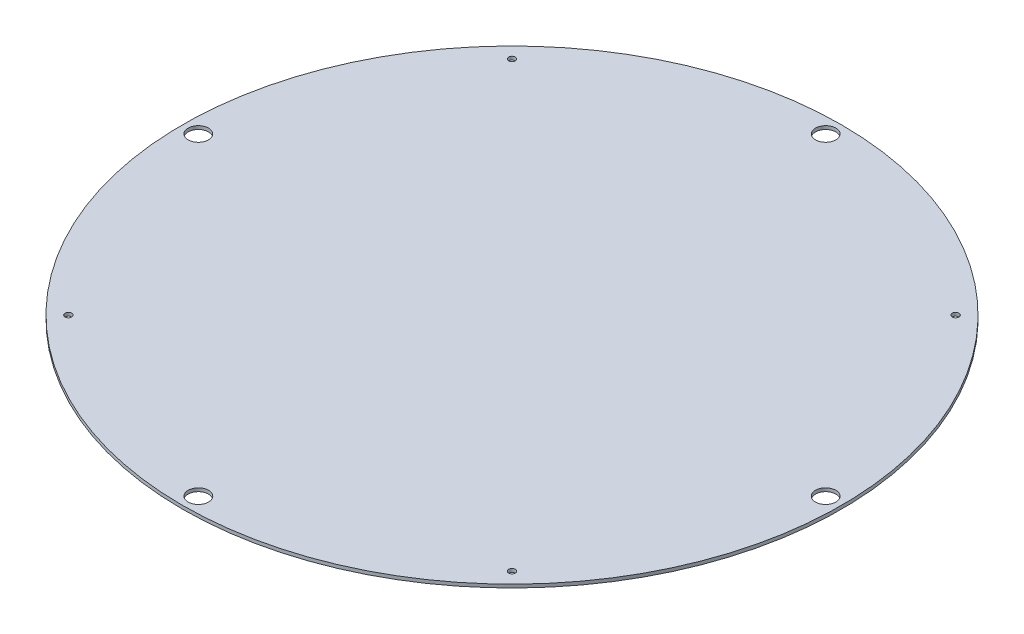
ISO-10303-21;
HEADER;
FILE_DESCRIPTION(('STEP AP214'),'2;1');
FILE_NAME('part.step','',(''),(''),'','','');
FILE_SCHEMA(('AUTOMOTIVE_DESIGN { 1 0 10303 214 1 1 1 1 }'));
ENDSEC;
DATA;
#1=APPLICATION_CONTEXT('core data for automotive mechanical design processes');
#2=APPLICATION_PROTOCOL_DEFINITION('international standard','automotive_design',2000,#1);
#3=PRODUCT_CONTEXT('',#1,'mechanical');
#4=PRODUCT('Part','Part','',(#3));
#5=PRODUCT_RELATED_PRODUCT_CATEGORY('part','',(#4));
#6=PRODUCT_DEFINITION_FORMATION('','',#4);
#7=PRODUCT_DEFINITION_CONTEXT('part definition',#1,'design');
#8=PRODUCT_DEFINITION('design','',#6,#7);
#9=PRODUCT_DEFINITION_SHAPE('','',#8);
#10=(LENGTH_UNIT() NAMED_UNIT(*) SI_UNIT(.MILLI.,.METRE.));
#11=(NAMED_UNIT(*) PLANE_ANGLE_UNIT() SI_UNIT($,.RADIAN.));
#12=(NAMED_UNIT(*) SI_UNIT($,.STERADIAN.) SOLID_ANGLE_UNIT());
#13=UNCERTAINTY_MEASURE_WITH_UNIT(LENGTH_MEASURE(1.E-05),#10,'distance_accuracy_value','');
#14=(GEOMETRIC_REPRESENTATION_CONTEXT(3) GLOBAL_UNCERTAINTY_ASSIGNED_CONTEXT((#13)) GLOBAL_UNIT_ASSIGNED_CONTEXT((#10,
#11,#12)) REPRESENTATION_CONTEXT('',''));
#15=CARTESIAN_POINT('',(0.,0.,0.));
#16=DIRECTION('',(0.,0.,1.));
#17=DIRECTION('',(1.,0.,0.));
#18=AXIS2_PLACEMENT_3D('',#15,#16,#17);
#19=CARTESIAN_POINT('',(394.086664394288,267.664131828965,1032.56245418889));
#20=DIRECTION('',(0.,1.,0.));
#21=DIRECTION('',(0.,0.,1.));
#22=AXIS2_PLACEMENT_3D('',#19,#20,#21);
#23=PLANE('',#22);
#24=CARTESIAN_POINT('',(526.669185866769,267.664131828965,1165.14497566137));
#25=DIRECTION('',(0.,1.,0.));
#26=DIRECTION('',(0.,0.,1.));
#27=AXIS2_PLACEMENT_3D('',#24,#25,#26);
#28=CIRCLE('',#27,2.00000000000565);
#29=CARTESIAN_POINT('',(526.669185866769,267.664131828965,1167.14497566137));
#30=VERTEX_POINT('',#29);
#31=EDGE_CURVE('E96',#30,#30,#28,.T.);
#32=ORIENTED_EDGE('',*,*,#31,.F.);
#33=EDGE_LOOP('',(#32));
#34=FACE_BOUND('',#33,.T.);
#35=CARTESIAN_POINT('',(261.50414292181,267.664131828965,899.979932716417));
#36=DIRECTION('',(0.,1.,0.));
#37=DIRECTION('',(0.,0.,1.));
#38=AXIS2_PLACEMENT_3D('',#35,#36,#37);
#39=CIRCLE('',#38,2.);
#40=CARTESIAN_POINT('',(261.50414292181,267.664131828965,901.979932716417));
#41=VERTEX_POINT('',#40);
#42=EDGE_CURVE('E80',#41,#41,#39,.T.);
#43=ORIENTED_EDGE('',*,*,#42,.F.);
#44=EDGE_LOOP('',(#43));
#45=FACE_BOUND('',#44,.T.);
#46=CARTESIAN_POINT('',(581.586664394293,267.664131828965,1032.56245418889));
#47=DIRECTION('',(0.,1.,0.));
#48=DIRECTION('',(0.,0.,1.));
#49=AXIS2_PLACEMENT_3D('',#46,#47,#48);
#50=CIRCLE('',#49,6.09999999999991);
#51=CARTESIAN_POINT('',(581.586664394293,267.664131828965,1038.66245418889));
#52=VERTEX_POINT('',#51);
#53=EDGE_CURVE('E65',#52,#52,#50,.T.);
#54=ORIENTED_EDGE('',*,*,#53,.F.);
#55=EDGE_LOOP('',(#54));
#56=FACE_BOUND('',#55,.T.);
#57=CARTESIAN_POINT('',(394.086664394288,267.664131828965,845.062454188894));
#58=DIRECTION('',(0.,1.,0.));
#59=DIRECTION('',(0.,0.,1.));
#60=AXIS2_PLACEMENT_3D('',#57,#58,#59);
#61=CIRCLE('',#60,6.1);
#62=CARTESIAN_POINT('',(394.086664394288,267.664131828965,851.162454188894));
#63=VERTEX_POINT('',#62);
#64=EDGE_CURVE('E51',#63,#63,#61,.T.);
#65=ORIENTED_EDGE('',*,*,#64,.F.);
#66=EDGE_LOOP('',(#65));
#67=FACE_BOUND('',#66,.T.);
#68=CARTESIAN_POINT('',(394.086664394288,267.664131828965,1032.56245418889));
#69=DIRECTION('',(0.,1.,0.));
#70=DIRECTION('',(0.,0.,1.));
#71=AXIS2_PLACEMENT_3D('',#68,#69,#70);
#72=CIRCLE('',#71,197.);
#73=CARTESIAN_POINT('',(394.086664394288,267.664131828965,1229.56245418889));
#74=VERTEX_POINT('',#73);
#75=EDGE_CURVE('E10',#74,#74,#72,.T.);
#76=ORIENTED_EDGE('',*,*,#75,.T.);
#77=EDGE_LOOP('',(#76));
#78=FACE_BOUND('',#77,.T.);
#79=CARTESIAN_POINT('',(394.086664394299,267.664131828965,1220.06245418889));
#80=DIRECTION('',(0.,1.,0.));
#81=DIRECTION('',(0.,0.,1.));
#82=AXIS2_PLACEMENT_3D('',#79,#80,#81);
#83=CIRCLE('',#82,6.09999999999986);
#84=CARTESIAN_POINT('',(394.086664394299,267.664131828965,1226.16245418889));
#85=VERTEX_POINT('',#84);
#86=EDGE_CURVE('E57',#85,#85,#83,.T.);
#87=ORIENTED_EDGE('',*,*,#86,.F.);
#88=EDGE_LOOP('',(#87));
#89=FACE_BOUND('',#88,.T.);
#90=CARTESIAN_POINT('',(206.586664394293,267.664131828965,1032.5624541889));
#91=DIRECTION('',(0.,1.,0.));
#92=DIRECTION('',(0.,0.,1.));
#93=AXIS2_PLACEMENT_3D('',#90,#91,#92);
#94=CIRCLE('',#93,6.09999999999989);
#95=CARTESIAN_POINT('',(206.586664394293,267.664131828965,1038.6624541889));
#96=VERTEX_POINT('',#95);
#97=EDGE_CURVE('E73',#96,#96,#94,.T.);
#98=ORIENTED_EDGE('',*,*,#97,.F.);
#99=EDGE_LOOP('',(#98));
#100=FACE_BOUND('',#99,.T.);
#101=CARTESIAN_POINT('',(526.669185866766,267.664131828965,899.979932716417));
#102=DIRECTION('',(0.,1.,0.));
#103=DIRECTION('',(0.,0.,1.));
#104=AXIS2_PLACEMENT_3D('',#101,#102,#103);
#105=CIRCLE('',#104,2.);
#106=CARTESIAN_POINT('',(526.669185866766,267.664131828965,901.979932716417));
#107=VERTEX_POINT('',#106);
#108=EDGE_CURVE('E88',#107,#107,#105,.T.);
#109=ORIENTED_EDGE('',*,*,#108,.F.);
#110=EDGE_LOOP('',(#109));
#111=FACE_BOUND('',#110,.T.);
#112=CARTESIAN_POINT('',(261.504142921814,267.664131828965,1165.14497566137));
#113=DIRECTION('',(0.,1.,0.));
#114=DIRECTION('',(0.,0.,1.));
#115=AXIS2_PLACEMENT_3D('',#112,#113,#114);
#116=CIRCLE('',#115,2.0000000000028);
#117=CARTESIAN_POINT('',(261.504142921814,267.664131828965,1167.14497566137));
#118=VERTEX_POINT('',#117);
#119=EDGE_CURVE('E103',#118,#118,#116,.T.);
#120=ORIENTED_EDGE('',*,*,#119,.F.);
#121=EDGE_LOOP('',(#120));
#122=FACE_BOUND('',#121,.T.);
#123=ADVANCED_FACE('F36',(#34,#45,#56,#67,#78,#89,#100,#111,#122),#23,.T.);
#124=CARTESIAN_POINT('',(394.086664394288,265.664131828965,1032.56245418889));
#125=DIRECTION('',(0.,1.,0.));
#126=DIRECTION('',(0.,0.,1.));
#127=AXIS2_PLACEMENT_3D('',#124,#125,#126);
#128=PLANE('',#127);
#129=CARTESIAN_POINT('',(394.086664394288,265.664131828965,1032.56245418889));
#130=DIRECTION('',(0.,1.,0.));
#131=DIRECTION('',(0.,0.,1.));
#132=AXIS2_PLACEMENT_3D('',#129,#130,#131);
#133=CIRCLE('',#132,197.);
#134=CARTESIAN_POINT('',(394.086664394288,265.664131828965,1229.56245418889));
#135=VERTEX_POINT('',#134);
#136=EDGE_CURVE('E40',#135,#135,#133,.T.);
#137=ORIENTED_EDGE('',*,*,#136,.F.);
#138=EDGE_LOOP('',(#137));
#139=FACE_BOUND('',#138,.T.);
#140=CARTESIAN_POINT('',(394.086664394288,265.664131828965,845.062454188894));
#141=DIRECTION('',(0.,1.,0.));
#142=DIRECTION('',(0.,0.,1.));
#143=AXIS2_PLACEMENT_3D('',#140,#141,#142);
#144=CIRCLE('',#143,6.1);
#145=CARTESIAN_POINT('',(394.086664394288,265.664131828965,851.162454188894));
#146=VERTEX_POINT('',#145);
#147=EDGE_CURVE('E53',#146,#146,#144,.T.);
#148=ORIENTED_EDGE('',*,*,#147,.T.);
#149=EDGE_LOOP('',(#148));
#150=FACE_BOUND('',#149,.T.);
#151=CARTESIAN_POINT('',(394.086664394299,265.664131828965,1220.06245418889));
#152=DIRECTION('',(0.,1.,0.));
#153=DIRECTION('',(0.,0.,1.));
#154=AXIS2_PLACEMENT_3D('',#151,#152,#153);
#155=CIRCLE('',#154,6.09999999999986);
#156=CARTESIAN_POINT('',(394.086664394299,265.664131828965,1226.16245418889));
#157=VERTEX_POINT('',#156);
#158=EDGE_CURVE('E61',#157,#157,#155,.T.);
#159=ORIENTED_EDGE('',*,*,#158,.T.);
#160=EDGE_LOOP('',(#159));
#161=FACE_BOUND('',#160,.T.);
#162=CARTESIAN_POINT('',(581.586664394293,265.664131828965,1032.56245418889));
#163=DIRECTION('',(0.,1.,0.));
#164=DIRECTION('',(0.,0.,1.));
#165=AXIS2_PLACEMENT_3D('',#162,#163,#164);
#166=CIRCLE('',#165,6.09999999999991);
#167=CARTESIAN_POINT('',(581.586664394293,265.664131828965,1038.66245418889));
#168=VERTEX_POINT('',#167);
#169=EDGE_CURVE('E69',#168,#168,#166,.T.);
#170=ORIENTED_EDGE('',*,*,#169,.T.);
#171=EDGE_LOOP('',(#170));
#172=FACE_BOUND('',#171,.T.);
#173=CARTESIAN_POINT('',(206.586664394293,265.664131828965,1032.5624541889));
#174=DIRECTION('',(0.,1.,0.));
#175=DIRECTION('',(0.,0.,1.));
#176=AXIS2_PLACEMENT_3D('',#173,#174,#175);
#177=CIRCLE('',#176,6.09999999999989);
#178=CARTESIAN_POINT('',(206.586664394293,265.664131828965,1038.6624541889));
#179=VERTEX_POINT('',#178);
#180=EDGE_CURVE('E77',#179,#179,#177,.T.);
#181=ORIENTED_EDGE('',*,*,#180,.T.);
#182=EDGE_LOOP('',(#181));
#183=FACE_BOUND('',#182,.T.);
#184=CARTESIAN_POINT('',(261.50414292181,265.664131828965,899.979932716417));
#185=DIRECTION('',(0.,1.,0.));
#186=DIRECTION('',(0.,0.,1.));
#187=AXIS2_PLACEMENT_3D('',#184,#185,#186);
#188=CIRCLE('',#187,2.);
#189=CARTESIAN_POINT('',(261.50414292181,265.664131828965,901.979932716417));
#190=VERTEX_POINT('',#189);
#191=EDGE_CURVE('E84',#190,#190,#188,.T.);
#192=ORIENTED_EDGE('',*,*,#191,.T.);
#193=EDGE_LOOP('',(#192));
#194=FACE_BOUND('',#193,.T.);
#195=CARTESIAN_POINT('',(526.669185866766,265.664131828965,899.979932716417));
#196=DIRECTION('',(0.,1.,0.));
#197=DIRECTION('',(0.,0.,1.));
#198=AXIS2_PLACEMENT_3D('',#195,#196,#197);
#199=CIRCLE('',#198,2.);
#200=CARTESIAN_POINT('',(526.669185866766,265.664131828965,901.979932716417));
#201=VERTEX_POINT('',#200);
#202=EDGE_CURVE('E92',#201,#201,#199,.T.);
#203=ORIENTED_EDGE('',*,*,#202,.T.);
#204=EDGE_LOOP('',(#203));
#205=FACE_BOUND('',#204,.T.);
#206=CARTESIAN_POINT('',(526.669185866769,265.664131828965,1165.14497566137));
#207=DIRECTION('',(0.,1.,0.));
#208=DIRECTION('',(0.,0.,1.));
#209=AXIS2_PLACEMENT_3D('',#206,#207,#208);
#210=CIRCLE('',#209,2.00000000000565);
#211=CARTESIAN_POINT('',(526.669185866769,265.664131828965,1167.14497566137));
#212=VERTEX_POINT('',#211);
#213=EDGE_CURVE('E100',#212,#212,#210,.T.);
#214=ORIENTED_EDGE('',*,*,#213,.T.);
#215=EDGE_LOOP('',(#214));
#216=FACE_BOUND('',#215,.T.);
#217=CARTESIAN_POINT('',(261.504142921814,265.664131828965,1165.14497566137));
#218=DIRECTION('',(0.,1.,0.));
#219=DIRECTION('',(0.,0.,1.));
#220=AXIS2_PLACEMENT_3D('',#217,#218,#219);
#221=CIRCLE('',#220,2.0000000000028);
#222=CARTESIAN_POINT('',(261.504142921814,265.664131828965,1167.14497566137));
#223=VERTEX_POINT('',#222);
#224=EDGE_CURVE('E107',#223,#223,#221,.T.);
#225=ORIENTED_EDGE('',*,*,#224,.T.);
#226=EDGE_LOOP('',(#225));
#227=FACE_BOUND('',#226,.T.);
#228=ADVANCED_FACE('F119',(#139,#150,#161,#172,#183,#194,#205,#216,#227),#128,.F.);
#229=CARTESIAN_POINT('',(394.086664394288,267.664131828965,1032.56245418889));
#230=DIRECTION('',(0.,-1.,0.));
#231=DIRECTION('',(0.,0.,-1.));
#232=AXIS2_PLACEMENT_3D('',#229,#230,#231);
#233=CYLINDRICAL_SURFACE('',#232,197.);
#234=ORIENTED_EDGE('',*,*,#75,.F.);
#235=EDGE_LOOP('',(#234));
#236=FACE_BOUND('',#235,.T.);
#237=ORIENTED_EDGE('',*,*,#136,.T.);
#238=EDGE_LOOP('',(#237));
#239=FACE_BOUND('',#238,.T.);
#240=ADVANCED_FACE('F38',(#236,#239),#233,.T.);
#241=CARTESIAN_POINT('',(394.086664394288,267.664131828965,845.062454188894));
#242=DIRECTION('',(0.,-1.,0.));
#243=DIRECTION('',(0.,0.,-1.));
#244=AXIS2_PLACEMENT_3D('',#241,#242,#243);
#245=CYLINDRICAL_SURFACE('',#244,6.1);
#246=ORIENTED_EDGE('',*,*,#64,.T.);
#247=EDGE_LOOP('',(#246));
#248=FACE_BOUND('',#247,.T.);
#249=ORIENTED_EDGE('',*,*,#147,.F.);
#250=EDGE_LOOP('',(#249));
#251=FACE_BOUND('',#250,.T.);
#252=ADVANCED_FACE('F129',(#248,#251),#245,.F.);
#253=CARTESIAN_POINT('',(394.086664394299,267.664131828965,1220.06245418889));
#254=DIRECTION('',(0.,-1.,0.));
#255=DIRECTION('',(0.,0.,-1.));
#256=AXIS2_PLACEMENT_3D('',#253,#254,#255);
#257=CYLINDRICAL_SURFACE('',#256,6.09999999999986);
#258=ORIENTED_EDGE('',*,*,#86,.T.);
#259=EDGE_LOOP('',(#258));
#260=FACE_BOUND('',#259,.T.);
#261=ORIENTED_EDGE('',*,*,#158,.F.);
#262=EDGE_LOOP('',(#261));
#263=FACE_BOUND('',#262,.T.);
#264=ADVANCED_FACE('F132',(#260,#263),#257,.F.);
#265=CARTESIAN_POINT('',(581.586664394293,267.664131828965,1032.56245418889));
#266=DIRECTION('',(0.,-1.,0.));
#267=DIRECTION('',(0.,0.,-1.));
#268=AXIS2_PLACEMENT_3D('',#265,#266,#267);
#269=CYLINDRICAL_SURFACE('',#268,6.09999999999991);
#270=ORIENTED_EDGE('',*,*,#53,.T.);
#271=EDGE_LOOP('',(#270));
#272=FACE_BOUND('',#271,.T.);
#273=ORIENTED_EDGE('',*,*,#169,.F.);
#274=EDGE_LOOP('',(#273));
#275=FACE_BOUND('',#274,.T.);
#276=ADVANCED_FACE('F136',(#272,#275),#269,.F.);
#277=CARTESIAN_POINT('',(206.586664394293,267.664131828965,1032.5624541889));
#278=DIRECTION('',(0.,-1.,0.));
#279=DIRECTION('',(0.,0.,-1.));
#280=AXIS2_PLACEMENT_3D('',#277,#278,#279);
#281=CYLINDRICAL_SURFACE('',#280,6.09999999999989);
#282=ORIENTED_EDGE('',*,*,#97,.T.);
#283=EDGE_LOOP('',(#282));
#284=FACE_BOUND('',#283,.T.);
#285=ORIENTED_EDGE('',*,*,#180,.F.);
#286=EDGE_LOOP('',(#285));
#287=FACE_BOUND('',#286,.T.);
#288=ADVANCED_FACE('F140',(#284,#287),#281,.F.);
#289=CARTESIAN_POINT('',(261.50414292181,267.664131828965,899.979932716417));
#290=DIRECTION('',(0.,-1.,0.));
#291=DIRECTION('',(0.,0.,-1.));
#292=AXIS2_PLACEMENT_3D('',#289,#290,#291);
#293=CYLINDRICAL_SURFACE('',#292,2.);
#294=ORIENTED_EDGE('',*,*,#42,.T.);
#295=EDGE_LOOP('',(#294));
#296=FACE_BOUND('',#295,.T.);
#297=ORIENTED_EDGE('',*,*,#191,.F.);
#298=EDGE_LOOP('',(#297));
#299=FACE_BOUND('',#298,.T.);
#300=ADVANCED_FACE('F144',(#296,#299),#293,.F.);
#301=CARTESIAN_POINT('',(526.669185866766,267.664131828965,899.979932716417));
#302=DIRECTION('',(0.,-1.,0.));
#303=DIRECTION('',(0.,0.,-1.));
#304=AXIS2_PLACEMENT_3D('',#301,#302,#303);
#305=CYLINDRICAL_SURFACE('',#304,2.);
#306=ORIENTED_EDGE('',*,*,#108,.T.);
#307=EDGE_LOOP('',(#306));
#308=FACE_BOUND('',#307,.T.);
#309=ORIENTED_EDGE('',*,*,#202,.F.);
#310=EDGE_LOOP('',(#309));
#311=FACE_BOUND('',#310,.T.);
#312=ADVANCED_FACE('F148',(#308,#311),#305,.F.);
#313=CARTESIAN_POINT('',(526.669185866769,267.664131828965,1165.14497566137));
#314=DIRECTION('',(0.,-1.,0.));
#315=DIRECTION('',(0.,0.,-1.));
#316=AXIS2_PLACEMENT_3D('',#313,#314,#315);
#317=CYLINDRICAL_SURFACE('',#316,2.00000000000565);
#318=ORIENTED_EDGE('',*,*,#31,.T.);
#319=EDGE_LOOP('',(#318));
#320=FACE_BOUND('',#319,.T.);
#321=ORIENTED_EDGE('',*,*,#213,.F.);
#322=EDGE_LOOP('',(#321));
#323=FACE_BOUND('',#322,.T.);
#324=ADVANCED_FACE('F152',(#320,#323),#317,.F.);
#325=CARTESIAN_POINT('',(261.504142921814,267.664131828965,1165.14497566137));
#326=DIRECTION('',(0.,-1.,0.));
#327=DIRECTION('',(0.,0.,-1.));
#328=AXIS2_PLACEMENT_3D('',#325,#326,#327);
#329=CYLINDRICAL_SURFACE('',#328,2.0000000000028);
#330=ORIENTED_EDGE('',*,*,#119,.T.);
#331=EDGE_LOOP('',(#330));
#332=FACE_BOUND('',#331,.T.);
#333=ORIENTED_EDGE('',*,*,#224,.F.);
#334=EDGE_LOOP('',(#333));
#335=FACE_BOUND('',#334,.T.);
#336=ADVANCED_FACE('F115',(#332,#335),#329,.F.);
#337=CLOSED_SHELL('',(#123,#228,#240,#252,#264,#276,#288,#300,#312,#324,#336));
#338=MANIFOLD_SOLID_BREP('B2',#337);
#339=ADVANCED_BREP_SHAPE_REPRESENTATION('',(#18,#338),#14);
#340=SHAPE_DEFINITION_REPRESENTATION(#9,#339);
ENDSEC;
END-ISO-10303-21;
